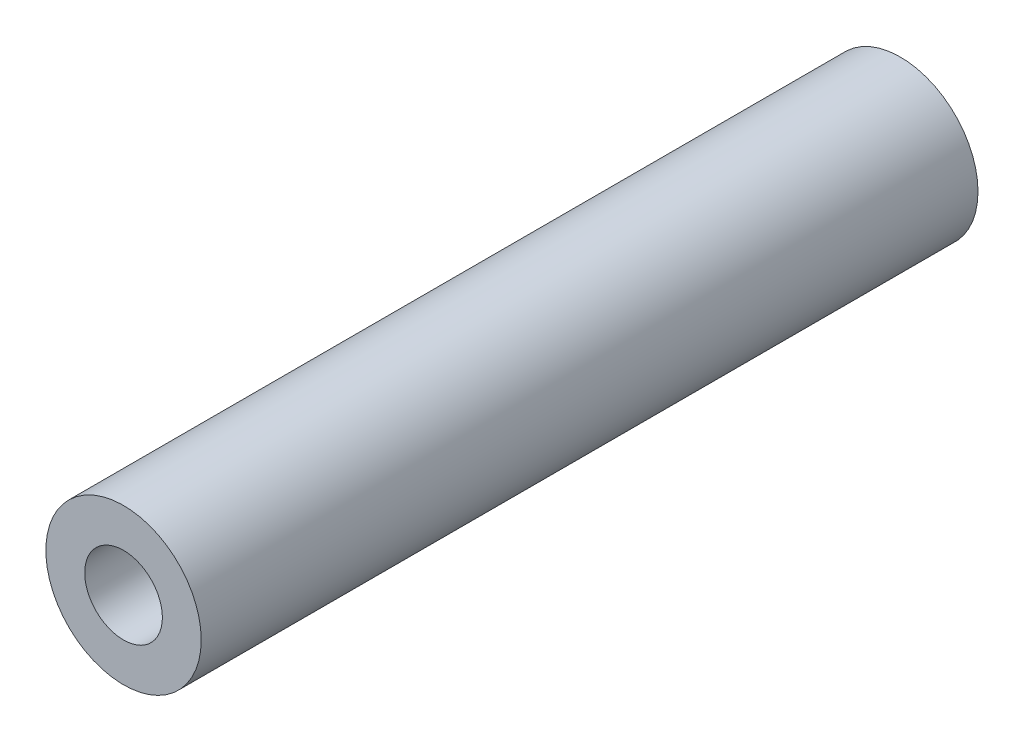
ISO-10303-21;
HEADER;
FILE_DESCRIPTION(('STEP AP214'),'2;1');
FILE_NAME('part.step','',(''),(''),'','','');
FILE_SCHEMA(('AUTOMOTIVE_DESIGN { 1 0 10303 214 1 1 1 1 }'));
ENDSEC;
DATA;
#1=APPLICATION_CONTEXT('core data for automotive mechanical design processes');
#2=APPLICATION_PROTOCOL_DEFINITION('international standard','automotive_design',2000,#1);
#3=PRODUCT_CONTEXT('',#1,'mechanical');
#4=PRODUCT('Part','Part','',(#3));
#5=PRODUCT_RELATED_PRODUCT_CATEGORY('part','',(#4));
#6=PRODUCT_DEFINITION_FORMATION('','',#4);
#7=PRODUCT_DEFINITION_CONTEXT('part definition',#1,'design');
#8=PRODUCT_DEFINITION('design','',#6,#7);
#9=PRODUCT_DEFINITION_SHAPE('','',#8);
#10=(LENGTH_UNIT() NAMED_UNIT(*) SI_UNIT(.MILLI.,.METRE.));
#11=(NAMED_UNIT(*) PLANE_ANGLE_UNIT() SI_UNIT($,.RADIAN.));
#12=(NAMED_UNIT(*) SI_UNIT($,.STERADIAN.) SOLID_ANGLE_UNIT());
#13=UNCERTAINTY_MEASURE_WITH_UNIT(LENGTH_MEASURE(1.E-05),#10,'distance_accuracy_value','');
#14=(GEOMETRIC_REPRESENTATION_CONTEXT(3) GLOBAL_UNCERTAINTY_ASSIGNED_CONTEXT((#13)) GLOBAL_UNIT_ASSIGNED_CONTEXT((#10,
#11,#12)) REPRESENTATION_CONTEXT('',''));
#15=CARTESIAN_POINT('',(0.,0.,0.));
#16=DIRECTION('',(0.,0.,1.));
#17=DIRECTION('',(1.,0.,0.));
#18=AXIS2_PLACEMENT_3D('',#15,#16,#17);
#19=CARTESIAN_POINT('',(0.,0.,50.));
#20=DIRECTION('',(0.,0.,-1.));
#21=DIRECTION('',(-1.,0.,0.));
#22=AXIS2_PLACEMENT_3D('',#19,#20,#21);
#23=CYLINDRICAL_SURFACE('',#22,5.);
#24=CARTESIAN_POINT('',(0.,0.,50.));
#25=DIRECTION('',(0.,0.,1.));
#26=DIRECTION('',(1.,0.,0.));
#27=AXIS2_PLACEMENT_3D('',#24,#25,#26);
#28=CIRCLE('',#27,5.);
#29=CARTESIAN_POINT('',(5.,0.,50.));
#30=VERTEX_POINT('',#29);
#31=EDGE_CURVE('E10',#30,#30,#28,.T.);
#32=ORIENTED_EDGE('',*,*,#31,.F.);
#33=EDGE_LOOP('',(#32));
#34=FACE_BOUND('',#33,.T.);
#35=CARTESIAN_POINT('',(0.,0.,0.));
#36=DIRECTION('',(0.,0.,1.));
#37=DIRECTION('',(1.,0.,0.));
#38=AXIS2_PLACEMENT_3D('',#35,#36,#37);
#39=CIRCLE('',#38,5.);
#40=CARTESIAN_POINT('',(5.,0.,0.));
#41=VERTEX_POINT('',#40);
#42=EDGE_CURVE('E44',#41,#41,#39,.T.);
#43=ORIENTED_EDGE('',*,*,#42,.T.);
#44=EDGE_LOOP('',(#43));
#45=FACE_BOUND('',#44,.T.);
#46=ADVANCED_FACE('F41',(#34,#45),#23,.T.);
#47=CARTESIAN_POINT('',(0.,0.,50.));
#48=DIRECTION('',(0.,0.,1.));
#49=DIRECTION('',(1.,0.,0.));
#50=AXIS2_PLACEMENT_3D('',#47,#48,#49);
#51=PLANE('',#50);
#52=CARTESIAN_POINT('',(0.,0.,50.));
#53=DIRECTION('',(0.,0.,1.));
#54=DIRECTION('',(1.,0.,0.));
#55=AXIS2_PLACEMENT_3D('',#52,#53,#54);
#56=CIRCLE('',#55,2.5);
#57=CARTESIAN_POINT('',(2.5,0.,50.));
#58=VERTEX_POINT('',#57);
#59=EDGE_CURVE('E63',#58,#58,#56,.T.);
#60=ORIENTED_EDGE('',*,*,#59,.F.);
#61=EDGE_LOOP('',(#60));
#62=FACE_BOUND('',#61,.T.);
#63=ORIENTED_EDGE('',*,*,#31,.T.);
#64=EDGE_LOOP('',(#63));
#65=FACE_BOUND('',#64,.T.);
#66=ADVANCED_FACE('F80',(#62,#65),#51,.T.);
#67=CARTESIAN_POINT('',(0.,0.,0.));
#68=DIRECTION('',(0.,0.,1.));
#69=DIRECTION('',(1.,0.,0.));
#70=AXIS2_PLACEMENT_3D('',#67,#68,#69);
#71=PLANE('',#70);
#72=CARTESIAN_POINT('',(0.,0.,0.));
#73=DIRECTION('',(0.,0.,-1.));
#74=DIRECTION('',(-1.,0.,0.));
#75=AXIS2_PLACEMENT_3D('',#72,#73,#74);
#76=CIRCLE('',#75,2.5);
#77=CARTESIAN_POINT('',(-2.5,0.,0.));
#78=VERTEX_POINT('',#77);
#79=EDGE_CURVE('E55',#78,#78,#76,.T.);
#80=ORIENTED_EDGE('',*,*,#79,.F.);
#81=EDGE_LOOP('',(#80));
#82=FACE_BOUND('',#81,.T.);
#83=ORIENTED_EDGE('',*,*,#42,.F.);
#84=EDGE_LOOP('',(#83));
#85=FACE_BOUND('',#84,.T.);
#86=ADVANCED_FACE('F82',(#82,#85),#71,.F.);
#87=CARTESIAN_POINT('',(0.,0.,8.));
#88=DIRECTION('',(0.,0.,-1.));
#89=DIRECTION('',(-1.,0.,0.));
#90=AXIS2_PLACEMENT_3D('',#87,#88,#89);
#91=CYLINDRICAL_SURFACE('',#90,2.5);
#92=CARTESIAN_POINT('',(0.,0.,8.));
#93=DIRECTION('',(0.,0.,-1.));
#94=DIRECTION('',(-1.,0.,0.));
#95=AXIS2_PLACEMENT_3D('',#92,#93,#94);
#96=CIRCLE('',#95,2.5);
#97=CARTESIAN_POINT('',(-2.5,0.,8.));
#98=VERTEX_POINT('',#97);
#99=EDGE_CURVE('E53',#98,#98,#96,.T.);
#100=ORIENTED_EDGE('',*,*,#99,.F.);
#101=EDGE_LOOP('',(#100));
#102=FACE_BOUND('',#101,.T.);
#103=ORIENTED_EDGE('',*,*,#79,.T.);
#104=EDGE_LOOP('',(#103));
#105=FACE_BOUND('',#104,.T.);
#106=ADVANCED_FACE('F88',(#102,#105),#91,.F.);
#107=CARTESIAN_POINT('',(0.,0.,8.));
#108=DIRECTION('',(0.,0.,-1.));
#109=DIRECTION('',(-1.,0.,0.));
#110=AXIS2_PLACEMENT_3D('',#107,#108,#109);
#111=PLANE('',#110);
#112=ORIENTED_EDGE('',*,*,#99,.T.);
#113=EDGE_LOOP('',(#112));
#114=FACE_BOUND('',#113,.T.);
#115=ADVANCED_FACE('F76',(#114),#111,.T.);
#116=CARTESIAN_POINT('',(0.,0.,42.));
#117=DIRECTION('',(0.,0.,1.));
#118=DIRECTION('',(1.,0.,0.));
#119=AXIS2_PLACEMENT_3D('',#116,#117,#118);
#120=CYLINDRICAL_SURFACE('',#119,2.5);
#121=CARTESIAN_POINT('',(0.,0.,42.));
#122=DIRECTION('',(0.,0.,1.));
#123=DIRECTION('',(1.,0.,0.));
#124=AXIS2_PLACEMENT_3D('',#121,#122,#123);
#125=CIRCLE('',#124,2.5);
#126=CARTESIAN_POINT('',(2.5,0.,42.));
#127=VERTEX_POINT('',#126);
#128=EDGE_CURVE('E59',#127,#127,#125,.T.);
#129=ORIENTED_EDGE('',*,*,#128,.F.);
#130=EDGE_LOOP('',(#129));
#131=FACE_BOUND('',#130,.T.);
#132=ORIENTED_EDGE('',*,*,#59,.T.);
#133=EDGE_LOOP('',(#132));
#134=FACE_BOUND('',#133,.T.);
#135=ADVANCED_FACE('F73',(#131,#134),#120,.F.);
#136=CARTESIAN_POINT('',(0.,0.,42.));
#137=DIRECTION('',(0.,0.,1.));
#138=DIRECTION('',(1.,0.,0.));
#139=AXIS2_PLACEMENT_3D('',#136,#137,#138);
#140=PLANE('',#139);
#141=ORIENTED_EDGE('',*,*,#128,.T.);
#142=EDGE_LOOP('',(#141));
#143=FACE_BOUND('',#142,.T.);
#144=ADVANCED_FACE('F71',(#143),#140,.T.);
#145=CLOSED_SHELL('',(#46,#66,#86,#106,#115,#135,#144));
#146=MANIFOLD_SOLID_BREP('B2',#145);
#147=ADVANCED_BREP_SHAPE_REPRESENTATION('',(#18,#146),#14);
#148=SHAPE_DEFINITION_REPRESENTATION(#9,#147);
ENDSEC;
END-ISO-10303-21;
